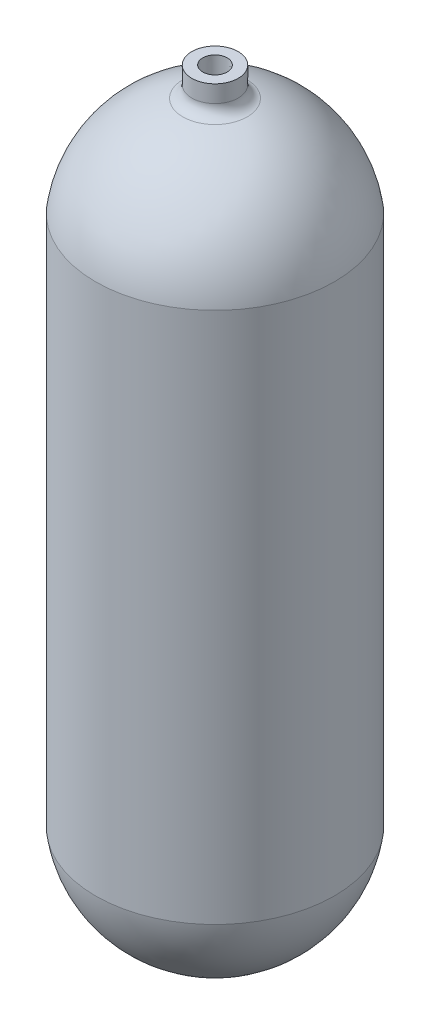
ISO-10303-21;
HEADER;
FILE_DESCRIPTION(('STEP AP214'),'2;1');
FILE_NAME('part.step','',(''),(''),'','','');
FILE_SCHEMA(('AUTOMOTIVE_DESIGN { 1 0 10303 214 1 1 1 1 }'));
ENDSEC;
DATA;
#1=APPLICATION_CONTEXT('core data for automotive mechanical design processes');
#2=APPLICATION_PROTOCOL_DEFINITION('international standard','automotive_design',2000,#1);
#3=PRODUCT_CONTEXT('',#1,'mechanical');
#4=PRODUCT('Part','Part','',(#3));
#5=PRODUCT_RELATED_PRODUCT_CATEGORY('part','',(#4));
#6=PRODUCT_DEFINITION_FORMATION('','',#4);
#7=PRODUCT_DEFINITION_CONTEXT('part definition',#1,'design');
#8=PRODUCT_DEFINITION('design','',#6,#7);
#9=PRODUCT_DEFINITION_SHAPE('','',#8);
#10=(LENGTH_UNIT() NAMED_UNIT(*) SI_UNIT(.MILLI.,.METRE.));
#11=(NAMED_UNIT(*) PLANE_ANGLE_UNIT() SI_UNIT($,.RADIAN.));
#12=(NAMED_UNIT(*) SI_UNIT($,.STERADIAN.) SOLID_ANGLE_UNIT());
#13=UNCERTAINTY_MEASURE_WITH_UNIT(LENGTH_MEASURE(1.E-05),#10,'distance_accuracy_value','');
#14=(GEOMETRIC_REPRESENTATION_CONTEXT(3) GLOBAL_UNCERTAINTY_ASSIGNED_CONTEXT((#13)) GLOBAL_UNIT_ASSIGNED_CONTEXT((#10,
#11,#12)) REPRESENTATION_CONTEXT('',''));
#15=CARTESIAN_POINT('',(0.,0.,0.));
#16=DIRECTION('',(0.,0.,1.));
#17=DIRECTION('',(1.,0.,0.));
#18=AXIS2_PLACEMENT_3D('',#15,#16,#17);
#19=CARTESIAN_POINT('',(0.,-195.,0.));
#20=DIRECTION('',(0.,1.,0.));
#21=DIRECTION('',(0.,0.,1.));
#22=AXIS2_PLACEMENT_3D('',#19,#20,#21);
#23=CYLINDRICAL_SURFACE('',#22,87.5);
#24=CARTESIAN_POINT('',(0.,-195.,0.));
#25=DIRECTION('',(0.,1.,0.));
#26=DIRECTION('',(0.,0.,1.));
#27=AXIS2_PLACEMENT_3D('',#24,#25,#26);
#28=CIRCLE('',#27,87.5);
#29=CARTESIAN_POINT('',(0.,-195.,87.5));
#30=VERTEX_POINT('',#29);
#31=EDGE_CURVE('E83',#30,#30,#28,.T.);
#32=ORIENTED_EDGE('',*,*,#31,.T.);
#33=EDGE_LOOP('',(#32));
#34=FACE_BOUND('',#33,.T.);
#35=CARTESIAN_POINT('',(0.,195.,0.));
#36=DIRECTION('',(0.,1.,0.));
#37=DIRECTION('',(0.,0.,1.));
#38=AXIS2_PLACEMENT_3D('',#35,#36,#37);
#39=CIRCLE('',#38,87.5);
#40=CARTESIAN_POINT('',(0.,195.,87.5000000000001));
#41=VERTEX_POINT('',#40);
#42=EDGE_CURVE('E63',#41,#41,#39,.T.);
#43=ORIENTED_EDGE('',*,*,#42,.F.);
#44=EDGE_LOOP('',(#43));
#45=FACE_BOUND('',#44,.T.);
#46=ADVANCED_FACE('F42',(#34,#45),#23,.T.);
#47=CARTESIAN_POINT('',(0.,-195.,0.));
#48=DIRECTION('',(0.,1.,0.));
#49=DIRECTION('',(0.,0.,1.));
#50=AXIS2_PLACEMENT_3D('',#47,#48,#49);
#51=CYLINDRICAL_SURFACE('',#50,79.5);
#52=CARTESIAN_POINT('',(0.,-195.,0.));
#53=DIRECTION('',(0.,1.,0.));
#54=DIRECTION('',(0.,0.,1.));
#55=AXIS2_PLACEMENT_3D('',#52,#53,#54);
#56=CIRCLE('',#55,79.5);
#57=CARTESIAN_POINT('',(0.,-195.,79.5));
#58=VERTEX_POINT('',#57);
#59=EDGE_CURVE('E57',#58,#58,#56,.T.);
#60=ORIENTED_EDGE('',*,*,#59,.F.);
#61=EDGE_LOOP('',(#60));
#62=FACE_BOUND('',#61,.T.);
#63=CARTESIAN_POINT('',(0.,195.,0.));
#64=DIRECTION('',(0.,1.,0.));
#65=DIRECTION('',(0.,0.,1.));
#66=AXIS2_PLACEMENT_3D('',#63,#64,#65);
#67=CIRCLE('',#66,79.5000000000001);
#68=CARTESIAN_POINT('',(0.,195.,79.5000000000001));
#69=VERTEX_POINT('',#68);
#70=EDGE_CURVE('E79',#69,#69,#67,.T.);
#71=ORIENTED_EDGE('',*,*,#70,.T.);
#72=EDGE_LOOP('',(#71));
#73=FACE_BOUND('',#72,.T.);
#74=ADVANCED_FACE('F102',(#62,#73),#51,.F.);
#75=CARTESIAN_POINT('',(0.,182.629934210526,0.));
#76=DIRECTION('',(0.,1.,0.));
#77=DIRECTION('',(0.,0.,1.));
#78=AXIS2_PLACEMENT_3D('',#75,#76,#77);
#79=SPHERICAL_SURFACE('',#78,80.4566251320295);
#80=CARTESIAN_POINT('',(0.,262.571806636372,0.));
#81=DIRECTION('',(0.,1.,0.));
#82=DIRECTION('',(0.,0.,1.));
#83=AXIS2_PLACEMENT_3D('',#80,#81,#82);
#84=CIRCLE('',#83,9.08655934255574);
#85=CARTESIAN_POINT('',(0.,262.571806636372,9.08655934255554));
#86=VERTEX_POINT('',#85);
#87=EDGE_CURVE('E69',#86,#86,#84,.T.);
#88=CARTESIAN_POINT('',(0.,195.,79.5000000000001));
#89=CARTESIAN_POINT('',(0.,196.079262227565,79.3320820161787));
#90=CARTESIAN_POINT('',(0.,197.155099889964,79.1421610968335));
#91=CARTESIAN_POINT('',(0.,199.298153148153,78.718685431606));
#92=CARTESIAN_POINT('',(0.,200.365368743945,78.4851306857238));
#93=CARTESIAN_POINT('',(0.,202.489404932645,77.9747594119331));
#94=CARTESIAN_POINT('',(0.,203.546225525555,77.6979428840246));
#95=CARTESIAN_POINT('',(0.,205.647719843179,77.1015112277354));
#96=CARTESIAN_POINT('',(0.,206.692393567893,76.7818960993546));
#97=CARTESIAN_POINT('',(0.,208.767861402045,76.1003962071325));
#98=CARTESIAN_POINT('',(0.,209.798655511482,75.7385114432912));
#99=CARTESIAN_POINT('',(0.,211.844654661614,74.9730727390054));
#100=CARTESIAN_POINT('',(0.,212.859859702309,74.569518798561));
#101=CARTESIAN_POINT('',(0.,214.872997041335,73.7214109327917));
#102=CARTESIAN_POINT('',(0.,215.870929339667,73.276857007467));
#103=CARTESIAN_POINT('',(0.,217.847866185931,72.347486459682));
#104=CARTESIAN_POINT('',(0.,218.826870733862,71.8626698372218));
#105=CARTESIAN_POINT('',(0.,220.764328456558,70.8535779294517));
#106=CARTESIAN_POINT('',(0.,221.722781631323,70.3293026441418));
#107=CARTESIAN_POINT('',(0.,223.617547069585,69.2421628920136));
#108=CARTESIAN_POINT('',(0.,224.553859333082,68.6792984251951));
#109=CARTESIAN_POINT('',(0.,226.402790129733,67.5159137873631));
#110=CARTESIAN_POINT('',(0.,227.315408662887,66.9153936163495));
#111=CARTESIAN_POINT('',(0.,229.115438474536,65.6776934977336));
#112=CARTESIAN_POINT('',(0.,230.002849753033,65.0405135501312));
#113=CARTESIAN_POINT('',(0.,231.750993335783,63.7305506038964));
#114=CARTESIAN_POINT('',(0.,232.611725640037,63.0577676052639));
#115=CARTESIAN_POINT('',(0.,234.305083800239,61.6777143281373));
#116=CARTESIAN_POINT('',(0.,235.137709656186,60.9704440496432));
#117=CARTESIAN_POINT('',(0.,236.773474058606,59.5225891790838));
#118=CARTESIAN_POINT('',(0.,237.576612605078,58.7820045870184));
#119=CARTESIAN_POINT('',(0.,239.152070430352,57.2687493054455));
#120=CARTESIAN_POINT('',(0.,239.924389709154,56.4960786159379));
#121=CARTESIAN_POINT('',(0.,241.436928152843,54.9199325685203));
#122=CARTESIAN_POINT('',(0.,242.17714731773,54.1164572106103));
#123=CARTESIAN_POINT('',(0.,243.624257923498,52.4800343431646));
#124=CARTESIAN_POINT('',(0.,244.33114936438,51.6470868336288));
#125=CARTESIAN_POINT('',(0.,245.710432184126,49.9531010575436));
#126=CARTESIAN_POINT('',(0.,246.38282356299,49.0920627909942));
#127=CARTESIAN_POINT('',(0.,247.691991137021,47.3433234823679));
#128=CARTESIAN_POINT('',(0.,248.328767332188,46.455622440291));
#129=CARTESIAN_POINT('',(0.,249.565648482827,44.6550297807444));
#130=CARTESIAN_POINT('',(0.,250.1657534383,43.7421381632748));
#131=CARTESIAN_POINT('',(0.,251.328296870694,41.8926783301758));
#132=CARTESIAN_POINT('',(0.,251.890735347616,40.9561101145464));
#133=CARTESIAN_POINT('',(0.,252.977013051558,39.0608503285892));
#134=CARTESIAN_POINT('',(0.,253.500852278578,38.1021587582614));
#135=CARTESIAN_POINT('',(0.,254.509062726479,36.1642421967362));
#136=CARTESIAN_POINT('',(0.,254.993433947359,35.1850172055387));
#137=CARTESIAN_POINT('',(0.,255.92190508018,33.2076577892769));
#138=CARTESIAN_POINT('',(0.,256.366004992121,32.2095233642126));
#139=CARTESIAN_POINT('',(0.,257.213196999094,30.196000428529));
#140=CARTESIAN_POINT('',(0.,257.616289094128,29.1806119179097));
#141=CARTESIAN_POINT('',(0.,258.380796941402,27.1342647701321));
#142=CARTESIAN_POINT('',(0.,258.742212693644,26.1033061329738));
#143=CARTESIAN_POINT('',(0.,259.422768547902,24.0275285288952));
#144=CARTESIAN_POINT('',(0.,259.741908649919,22.9827095619748));
#145=CARTESIAN_POINT('',(0.,260.337383632242,20.8809440234037));
#146=CARTESIAN_POINT('',(0.,260.613718512548,19.8239974517529));
#147=CARTESIAN_POINT('',(0.,261.123125872193,17.699729759213));
#148=CARTESIAN_POINT('',(0.,261.356198351532,16.6324086383238));
#149=CARTESIAN_POINT('',(0.,261.778690244768,14.4891612965149));
#150=CARTESIAN_POINT('',(0.,261.968109658665,13.4132350755952));
#151=CARTESIAN_POINT('',(0.,262.302996683809,11.2545642839117));
#152=CARTESIAN_POINT('',(0.,262.448464295055,10.171819713148));
#153=CARTESIAN_POINT('',(0.,262.571806636372,9.08655934255554));
#154=B_SPLINE_CURVE_WITH_KNOTS('',3,(#88,#89,#90,#91,#92,#93,#94,#95,#96,#97,#98,#99,#100,#101,
#102,#103,#104,#105,#106,#107,#108,#109,#110,#111,#112,#113,#114,#115,#116,#117,#118,#119,#120,
#121,#122,#123,#124,#125,#126,#127,#128,#129,#130,#131,#132,#133,#134,#135,#136,#137,#138,#139,
#140,#141,#142,#143,#144,#145,#146,#147,#148,#149,#150,#151,#152,#153),.UNSPECIFIED.,.F.,.F.,(4,
2,2,2,2,2,2,2,2,2,2,2,2,2,2,2,2,2,2,2,2,2,2,2,2,2,2,2,2,2,2,2,4),(0.,3.27651283401039,
6.55302566802081,9.82953850203122,13.1060513360417,16.382564170052,19.6590770040625,
22.9355898380729,26.2121026720833,29.4886155060937,32.7651283401041,36.0416411741145,
39.3181540081249,42.5946668421354,45.8711796761458,49.1476925101562,52.4242053441666,
55.700718178177,58.9772310121874,62.2537438461978,65.5302566802082,68.8067695142187,
72.0832823482291,75.3597951822395,78.6363080162499,81.9128208502603,85.1893336842708,
88.4658465182811,91.7423593522916,95.018872186302,98.2953850203124,101.571897854323,
104.848410688333),.UNSPECIFIED.);
#155=EDGE_CURVE('BSEAM106',#69,#86,#154,.T.);
#156=ORIENTED_EDGE('',*,*,#70,.F.);
#157=ORIENTED_EDGE('',*,*,#87,.T.);
#158=ORIENTED_EDGE('',*,*,#155,.T.);
#159=ORIENTED_EDGE('',*,*,#155,.F.);
#160=EDGE_LOOP('',(#156,#158,#157,#159));
#161=FACE_BOUND('',#160,.T.);
#162=ADVANCED_FACE('F106',(#161),#79,.F.);
#163=CARTESIAN_POINT('',(0.,289.,0.));
#164=DIRECTION('',(0.,-1.,0.));
#165=DIRECTION('',(0.,0.,-1.));
#166=AXIS2_PLACEMENT_3D('',#163,#164,#165);
#167=CONICAL_SURFACE('',#166,9.00000000000001,0.00327525350858995);
#168=ORIENTED_EDGE('',*,*,#87,.F.);
#169=EDGE_LOOP('',(#168));
#170=FACE_BOUND('',#169,.T.);
#171=CARTESIAN_POINT('',(0.,289.,0.));
#172=DIRECTION('',(0.,1.,0.));
#173=DIRECTION('',(0.,0.,1.));
#174=AXIS2_PLACEMENT_3D('',#171,#172,#173);
#175=CIRCLE('',#174,9.00000000000001);
#176=CARTESIAN_POINT('',(0.,289.,9.00000000000001));
#177=VERTEX_POINT('',#176);
#178=EDGE_CURVE('E73',#177,#177,#175,.T.);
#179=ORIENTED_EDGE('',*,*,#178,.T.);
#180=EDGE_LOOP('',(#179));
#181=FACE_BOUND('',#180,.T.);
#182=ADVANCED_FACE('F112',(#170,#181),#167,.F.);
#183=CARTESIAN_POINT('',(0.,289.,0.));
#184=DIRECTION('',(0.,1.,0.));
#185=DIRECTION('',(0.,0.,1.));
#186=AXIS2_PLACEMENT_3D('',#183,#184,#185);
#187=PLANE('',#186);
#188=CARTESIAN_POINT('',(0.,289.,0.));
#189=DIRECTION('',(0.,1.,0.));
#190=DIRECTION('',(0.,0.,1.));
#191=AXIS2_PLACEMENT_3D('',#188,#189,#190);
#192=CIRCLE('',#191,17.);
#193=CARTESIAN_POINT('',(0.,289.,17.));
#194=VERTEX_POINT('',#193);
#195=EDGE_CURVE('E76',#194,#194,#192,.T.);
#196=ORIENTED_EDGE('',*,*,#195,.T.);
#197=EDGE_LOOP('',(#196));
#198=FACE_BOUND('',#197,.T.);
#199=ORIENTED_EDGE('',*,*,#178,.F.);
#200=EDGE_LOOP('',(#199));
#201=FACE_BOUND('',#200,.T.);
#202=ADVANCED_FACE('F116',(#198,#201),#187,.T.);
#203=CARTESIAN_POINT('',(0.,271.,0.));
#204=DIRECTION('',(0.,1.,0.));
#205=DIRECTION('',(0.,0.,1.));
#206=AXIS2_PLACEMENT_3D('',#203,#204,#205);
#207=CYLINDRICAL_SURFACE('',#206,17.);
#208=CARTESIAN_POINT('',(0.,276.464521180611,0.));
#209=DIRECTION('',(0.,-1.,0.));
#210=DIRECTION('',(0.,0.,-1.));
#211=AXIS2_PLACEMENT_3D('',#208,#209,#210);
#212=CIRCLE('',#211,17.);
#213=CARTESIAN_POINT('',(0.,276.464521180611,-17.));
#214=VERTEX_POINT('',#213);
#215=EDGE_CURVE('E50',#214,#214,#212,.F.);
#216=ORIENTED_EDGE('',*,*,#215,.T.);
#217=EDGE_LOOP('',(#216));
#218=FACE_BOUND('',#217,.T.);
#219=ORIENTED_EDGE('',*,*,#195,.F.);
#220=EDGE_LOOP('',(#219));
#221=FACE_BOUND('',#220,.T.);
#222=ADVANCED_FACE('F120',(#218,#221),#207,.T.);
#223=CARTESIAN_POINT('',(0.,182.629934210526,0.));
#224=DIRECTION('',(0.,1.,0.));
#225=DIRECTION('',(0.,0.,1.));
#226=AXIS2_PLACEMENT_3D('',#223,#224,#225);
#227=SPHERICAL_SURFACE('',#226,88.3700657894737);
#228=CARTESIAN_POINT('',(0.,267.791308567644,0.));
#229=DIRECTION('',(0.,-1.,0.));
#230=DIRECTION('',(0.,0.,-1.));
#231=AXIS2_PLACEMENT_3D('',#228,#229,#230);
#232=CIRCLE('',#231,23.5967973513961);
#233=CARTESIAN_POINT('',(0.,267.791308567644,23.5967973513957));
#234=VERTEX_POINT('',#233);
#235=EDGE_CURVE('E10',#234,#234,#232,.T.);
#236=CARTESIAN_POINT('',(0.,267.791308567644,23.5967973513957));
#237=CARTESIAN_POINT('',(0.,267.506176332494,24.6258802126344));
#238=CARTESIAN_POINT('',(0.,267.202374044006,25.649789318234));
#239=CARTESIAN_POINT('',(0.,266.55786681221,27.6859266679124));
#240=CARTESIAN_POINT('',(0.,266.217161868901,28.6981549119911));
#241=CARTESIAN_POINT('',(0.,265.49928677932,30.7095971883846));
#242=CARTESIAN_POINT('',(0.,265.122116633048,31.7088112206993));
#243=CARTESIAN_POINT('',(0.,264.331809499324,33.6929129372721));
#244=CARTESIAN_POINT('',(0.,263.918672511873,34.6778006215301));
#245=CARTESIAN_POINT('',(0.,263.056973837848,36.6319552290496));
#246=CARTESIAN_POINT('',(0.,262.608412151273,37.6012221523111));
#247=CARTESIAN_POINT('',(0.,261.67645370334,39.5228616464591));
#248=CARTESIAN_POINT('',(0.,261.193056941981,40.4752342173456));
#249=CARTESIAN_POINT('',(0.,260.192063493472,42.3618335360686));
#250=CARTESIAN_POINT('',(0.,259.674466806323,43.2960602839051));
#251=CARTESIAN_POINT('',(0.,258.605753662216,45.1451403513584));
#252=CARTESIAN_POINT('',(0.,258.054637205259,46.0599936709752));
#253=CARTESIAN_POINT('',(0.,256.91960870583,47.869124728564));
#254=CARTESIAN_POINT('',(0.,256.335696663358,48.7634024665359));
#255=CARTESIAN_POINT('',(0.,255.135844276655,50.5302072460325));
#256=CARTESIAN_POINT('',(0.,254.519903932424,51.4027342875572));
#257=CARTESIAN_POINT('',(0.,253.256804311083,53.1248911401952));
#258=CARTESIAN_POINT('',(0.,252.609645033972,53.9745209513086));
#259=CARTESIAN_POINT('',(0.,251.284957938966,55.6497668971053));
#260=CARTESIAN_POINT('',(0.,250.607430121071,56.4753830317886));
#261=CARTESIAN_POINT('',(0.,249.222896241922,58.1015167335656));
#262=CARTESIAN_POINT('',(0.,248.515890180669,58.9020343006592));
#263=CARTESIAN_POINT('',(0.,247.073328847793,60.4769189565822));
#264=CARTESIAN_POINT('',(0.,246.33777357617,61.2512860454115));
#265=CARTESIAN_POINT('',(0.,244.839080370292,62.7728521968568));
#266=CARTESIAN_POINT('',(0.,244.075942436037,63.5200512594727));
#267=CARTESIAN_POINT('',(0.,242.523086697304,64.9862995103676));
#268=CARTESIAN_POINT('',(0.,241.733368892826,65.7053486986465));
#269=CARTESIAN_POINT('',(0.,240.128391133023,67.114352342754));
#270=CARTESIAN_POINT('',(0.,239.313131177698,67.8043067985827));
#271=CARTESIAN_POINT('',(0.,237.65814039894,69.154214351267));
#272=CARTESIAN_POINT('',(0.,236.818409575506,69.8141674481227));
#273=CARTESIAN_POINT('',(0.,235.115580498924,71.1032050792702));
#274=CARTESIAN_POINT('',(0.,234.252482245775,71.7322896135619));
#275=CARTESIAN_POINT('',(0.,232.504052453852,72.9587634784634));
#276=CARTESIAN_POINT('',(0.,231.618720915078,73.5561528090731));
#277=CARTESIAN_POINT('',(0.,229.826987911379,74.7184512741942));
#278=CARTESIAN_POINT('',(0.,228.920586446455,75.2833604087057));
#279=CARTESIAN_POINT('',(0.,227.087904636625,76.3799561694588));
#280=CARTESIAN_POINT('',(0.,226.161624291719,76.9116427957004));
#281=CARTESIAN_POINT('',(0.,224.290401889685,77.9410948832923));
#282=CARTESIAN_POINT('',(0.,223.345459832557,78.4388603446425));
#283=CARTESIAN_POINT('',(0.,221.438155696104,79.3998160198936));
#284=CARTESIAN_POINT('',(0.,220.475793616779,79.8630062337944));
#285=CARTESIAN_POINT('',(0.,218.534914016296,80.7542027634546));
#286=CARTESIAN_POINT('',(0.,217.556396495138,81.182209079214));
#287=CARTESIAN_POINT('',(0.,215.584491821107,82.0024753998514));
#288=CARTESIAN_POINT('',(0.,214.591104668233,82.3947354047294));
#289=CARTESIAN_POINT('',(0.,212.590766076845,83.1429936443519));
#290=CARTESIAN_POINT('',(0.,211.583814638329,83.4989918790963));
#291=CARTESIAN_POINT('',(0.,209.557670658068,84.1742588377098));
#292=CARTESIAN_POINT('',(0.,208.538478116322,84.4935275615788));
#293=CARTESIAN_POINT('',(0.,206.489191151203,85.0949157635767));
#294=CARTESIAN_POINT('',(0.,205.459096727831,85.3770352417056));
#295=CARTESIAN_POINT('',(0.,203.389359718545,85.9037549961442));
#296=CARTESIAN_POINT('',(0.,202.349717132633,86.148355272454));
#297=CARTESIAN_POINT('',(0.,200.262249422113,86.5997123739156));
#298=CARTESIAN_POINT('',(0.,199.214424297505,86.8064691990675));
#299=CARTESIAN_POINT('',(0.,197.111970281185,87.1818782930577));
#300=CARTESIAN_POINT('',(0.,196.057341389471,87.3505305618962));
#301=CARTESIAN_POINT('',(0.,195.,87.5000000000001));
#302=B_SPLINE_CURVE_WITH_KNOTS('',3,(#236,#237,#238,#239,#240,#241,#242,#243,#244,#245,#246,
#247,#248,#249,#250,#251,#252,#253,#254,#255,#256,#257,#258,#259,#260,#261,#262,#263,#264,#265,
#266,#267,#268,#269,#270,#271,#272,#273,#274,#275,#276,#277,#278,#279,#280,#281,#282,#283,#284,
#285,#286,#287,#288,#289,#290,#291,#292,#293,#294,#295,#296,#297,#298,#299,#300,#301),
.UNSPECIFIED.,.F.,.F.,(4,2,2,2,2,2,2,2,2,2,2,2,2,2,2,2,2,2,2,2,2,2,2,2,2,2,2,2,2,2,2,2,4),(0.,
3.203385285989,6.40677057197797,9.61015585796696,12.8135411439559,16.0169264299449,
19.2203117159339,22.4236970019229,25.6270822879119,28.8304675739008,32.0338528598898,
35.2372381458788,38.4406234318678,41.6440087178568,44.8473940038458,48.0507792898348,
51.2541645758238,54.4575498618127,57.6609351478017,60.8643204337907,64.0677057197797,
67.2710910057687,70.4744762917576,73.6778615777466,76.8812468637356,80.0846321497246,
83.2880174357136,86.4914027217026,89.6947880076916,92.8981732936805,96.1015585796695,
99.3049438656585,102.508329151647),.UNSPECIFIED.);
#303=EDGE_CURVE('BSEAM98',#234,#41,#302,.T.);
#304=ORIENTED_EDGE('',*,*,#235,.T.);
#305=ORIENTED_EDGE('',*,*,#42,.T.);
#306=ORIENTED_EDGE('',*,*,#303,.T.);
#307=ORIENTED_EDGE('',*,*,#303,.F.);
#308=EDGE_LOOP('',(#304,#306,#305,#307));
#309=FACE_BOUND('',#308,.T.);
#310=ADVANCED_FACE('F98',(#309),#227,.T.);
#311=CARTESIAN_POINT('',(0.,-182.629934210526,0.));
#312=DIRECTION('',(0.,1.,0.));
#313=DIRECTION('',(0.,0.,1.));
#314=AXIS2_PLACEMENT_3D('',#311,#312,#313);
#315=SPHERICAL_SURFACE('',#314,80.4566251320294);
#316=ORIENTED_EDGE('',*,*,#59,.T.);
#317=EDGE_LOOP('',(#316));
#318=FACE_BOUND('',#317,.T.);
#319=ADVANCED_FACE('F91',(#318),#315,.F.);
#320=CARTESIAN_POINT('',(0.,-182.629934210526,0.));
#321=DIRECTION('',(0.,1.,0.));
#322=DIRECTION('',(0.,0.,1.));
#323=AXIS2_PLACEMENT_3D('',#320,#321,#322);
#324=SPHERICAL_SURFACE('',#323,88.3700657894737);
#325=ORIENTED_EDGE('',*,*,#31,.F.);
#326=EDGE_LOOP('',(#325));
#327=FACE_BOUND('',#326,.T.);
#328=ADVANCED_FACE('F89',(#327),#324,.T.);
#329=CARTESIAN_POINT('',(0.,276.464521180611,0.));
#330=DIRECTION('',(0.,-1.,0.));
#331=DIRECTION('',(0.,0.,-1.));
#332=AXIS2_PLACEMENT_3D('',#329,#330,#331);
#333=TOROIDAL_SURFACE('',#332,26.,9.);
#334=ORIENTED_EDGE('',*,*,#235,.F.);
#335=EDGE_LOOP('',(#334));
#336=FACE_BOUND('',#335,.T.);
#337=ORIENTED_EDGE('',*,*,#215,.F.);
#338=EDGE_LOOP('',(#337));
#339=FACE_BOUND('',#338,.T.);
#340=ADVANCED_FACE('F44',(#336,#339),#333,.F.);
#341=CLOSED_SHELL('',(#46,#74,#162,#182,#202,#222,#310,#319,#328,#340));
#342=MANIFOLD_SOLID_BREP('B2',#341);
#343=ADVANCED_BREP_SHAPE_REPRESENTATION('',(#18,#342),#14);
#344=SHAPE_DEFINITION_REPRESENTATION(#9,#343);
ENDSEC;
END-ISO-10303-21;
